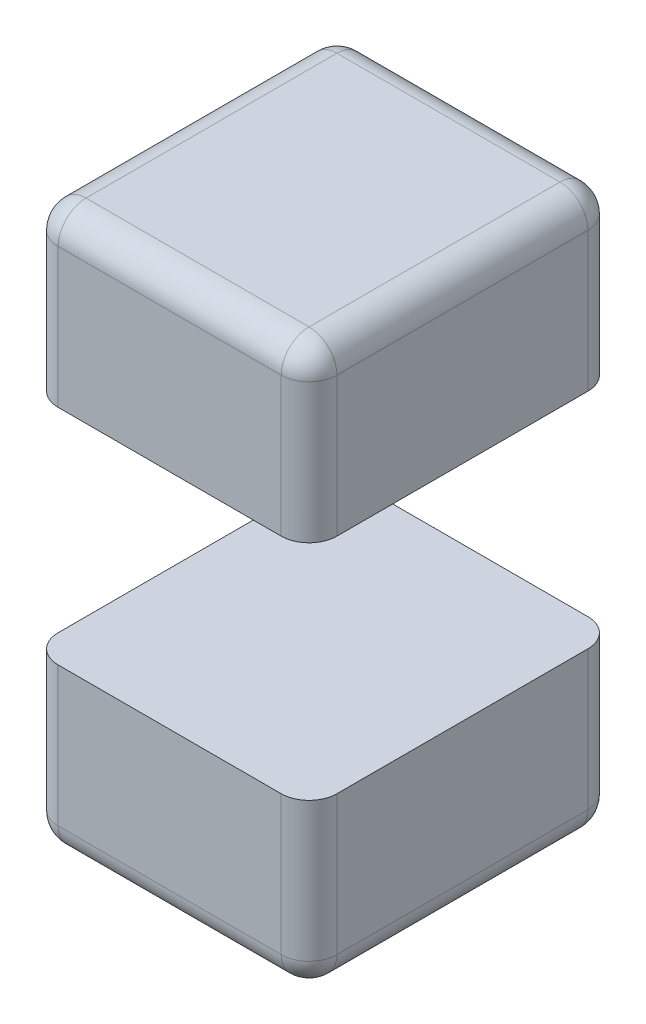
ISO-10303-21;
HEADER;
FILE_DESCRIPTION(('STEP AP214'),'2;1');
FILE_NAME('part.step','',(''),(''),'','','');
FILE_SCHEMA(('AUTOMOTIVE_DESIGN { 1 0 10303 214 1 1 1 1 }'));
ENDSEC;
DATA;
#1=APPLICATION_CONTEXT('core data for automotive mechanical design processes');
#2=APPLICATION_PROTOCOL_DEFINITION('international standard','automotive_design',2000,#1);
#3=PRODUCT_CONTEXT('',#1,'mechanical');
#4=PRODUCT('Part','Part','',(#3));
#5=PRODUCT_RELATED_PRODUCT_CATEGORY('part','',(#4));
#6=PRODUCT_DEFINITION_FORMATION('','',#4);
#7=PRODUCT_DEFINITION_CONTEXT('part definition',#1,'design');
#8=PRODUCT_DEFINITION('design','',#6,#7);
#9=PRODUCT_DEFINITION_SHAPE('','',#8);
#10=(LENGTH_UNIT() NAMED_UNIT(*) SI_UNIT(.MILLI.,.METRE.));
#11=(NAMED_UNIT(*) PLANE_ANGLE_UNIT() SI_UNIT($,.RADIAN.));
#12=(NAMED_UNIT(*) SI_UNIT($,.STERADIAN.) SOLID_ANGLE_UNIT());
#13=UNCERTAINTY_MEASURE_WITH_UNIT(LENGTH_MEASURE(1.E-05),#10,'distance_accuracy_value','');
#14=(GEOMETRIC_REPRESENTATION_CONTEXT(3) GLOBAL_UNCERTAINTY_ASSIGNED_CONTEXT((#13)) GLOBAL_UNIT_ASSIGNED_CONTEXT((#10,
#11,#12)) REPRESENTATION_CONTEXT('',''));
#15=CARTESIAN_POINT('',(0.,0.,0.));
#16=DIRECTION('',(0.,0.,1.));
#17=DIRECTION('',(1.,0.,0.));
#18=AXIS2_PLACEMENT_3D('',#15,#16,#17);
#19=CARTESIAN_POINT('',(13.574981507597,8.599994865557,0.));
#20=DIRECTION('',(4.371138828674E-08,-0.999999999999999,0.));
#21=DIRECTION('',(0.999999999999999,4.371138828674E-08,0.));
#22=AXIS2_PLACEMENT_3D('',#19,#20,#21);
#23=PLANE('',#22);
#24=DIRECTION('',(0.,0.,-1.));
#25=VECTOR('',#24,1.);
#26=CARTESIAN_POINT('',(14.024981507597,8.599994885227,0.));
#27=LINE('',#26,#25);
#28=CARTESIAN_POINT('',(14.0249815075972,8.5999948852266,0.05));
#29=VERTEX_POINT('',#28);
#30=CARTESIAN_POINT('',(14.0249815075972,8.5999948852266,0.5));
#31=VERTEX_POINT('',#30);
#32=EDGE_CURVE('P0_E96',#29,#31,#27,.F.);
#33=ORIENTED_EDGE('',*,*,#32,.F.);
#34=DIRECTION('',(-0.999999999999999,-4.371138828674E-08,0.));
#35=VECTOR('',#34,1.);
#36=CARTESIAN_POINT('',(13.6999815075974,8.59999487102,0.05));
#37=LINE('',#36,#35);
#38=CARTESIAN_POINT('',(13.6249815075972,8.59999486774182,0.05));
#39=VERTEX_POINT('',#38);
#40=EDGE_CURVE('P0_E117',#39,#29,#37,.F.);
#41=ORIENTED_EDGE('',*,*,#40,.F.);
#42=DIRECTION('',(0.,0.,-1.));
#43=VECTOR('',#42,1.);
#44=CARTESIAN_POINT('',(13.624981507597,8.599994867742,0.));
#45=LINE('',#44,#43);
#46=CARTESIAN_POINT('',(13.6249815075972,8.59999486774182,0.5));
#47=VERTEX_POINT('',#46);
#48=EDGE_CURVE('P0_E338',#47,#39,#45,.T.);
#49=ORIENTED_EDGE('',*,*,#48,.F.);
#50=DIRECTION('',(-0.999999999999999,-4.371138828674E-08,0.));
#51=VECTOR('',#50,1.);
#52=CARTESIAN_POINT('',(13.6999815075974,8.59999487102,0.5));
#53=LINE('',#52,#51);
#54=EDGE_CURVE('P0_E349',#31,#47,#53,.T.);
#55=ORIENTED_EDGE('',*,*,#54,.F.);
#56=EDGE_LOOP('',(#33,#41,#49,#55));
#57=FACE_BOUND('',#56,.T.);
#58=ADVANCED_FACE('P0_F17',(#57),#23,.F.);
#59=CARTESIAN_POINT('',(14.024981509783,8.549994885227,0.));
#60=DIRECTION('',(0.,0.,-1.));
#61=DIRECTION('',(-1.,0.,0.));
#62=AXIS2_PLACEMENT_3D('',#59,#60,#61);
#63=CYLINDRICAL_SURFACE('',#62,0.05);
#64=CARTESIAN_POINT('',(14.024981509783,8.549994885227,0.5));
#65=DIRECTION('',(0.,0.,-1.));
#66=DIRECTION('',(-1.,0.,0.));
#67=AXIS2_PLACEMENT_3D('',#64,#65,#66);
#68=CIRCLE('',#67,0.05);
#69=CARTESIAN_POINT('',(14.0749815097829,8.54999488741228,0.5));
#70=VERTEX_POINT('',#69);
#71=EDGE_CURVE('P0_E129',#70,#31,#68,.F.);
#72=ORIENTED_EDGE('',*,*,#71,.F.);
#73=DIRECTION('',(0.,0.,1.));
#74=VECTOR('',#73,1.);
#75=CARTESIAN_POINT('',(14.0749815097826,8.549994887412,0.));
#76=LINE('',#75,#74);
#77=CARTESIAN_POINT('',(14.0749815097829,8.54999488741228,0.05));
#78=VERTEX_POINT('',#77);
#79=EDGE_CURVE('P0_E125',#70,#78,#76,.F.);
#80=ORIENTED_EDGE('',*,*,#79,.T.);
#81=CARTESIAN_POINT('',(14.024981509783,8.549994885227,0.05));
#82=DIRECTION('',(0.,0.,-1.));
#83=DIRECTION('',(-1.,0.,0.));
#84=AXIS2_PLACEMENT_3D('',#81,#82,#83);
#85=CIRCLE('',#84,0.05);
#86=EDGE_CURVE('P0_E20',#29,#78,#85,.T.);
#87=ORIENTED_EDGE('',*,*,#86,.F.);
#88=ORIENTED_EDGE('',*,*,#32,.T.);
#89=EDGE_LOOP('',(#72,#80,#87,#88));
#90=FACE_BOUND('',#89,.T.);
#91=ADVANCED_FACE('P0_F105',(#90),#63,.T.);
#92=CARTESIAN_POINT('',(14.024981509783,8.549994885227,0.05));
#93=DIRECTION('',(0.577350243953125,0.577350294426125,-0.577350269189626));
#94=DIRECTION('',(0.707106812094878,-0.707106750278215,1.15130127653629E-13));
#95=AXIS2_PLACEMENT_3D('',#92,#93,#94);
#96=SPHERICAL_SURFACE('',#95,0.05);
#97=CARTESIAN_POINT('',(14.0538490219807,8.5788623999483,0.0211324865405184));
#98=VERTEX_POINT('',#97);
#99=VERTEX_LOOP('',#98);
#100=FACE_BOUND('',#99,.T.);
#101=ORIENTED_EDGE('',*,*,#86,.T.);
#102=CARTESIAN_POINT('',(14.0249815097832,8.549994885227,0.05));
#103=DIRECTION('',(-4.371138828674E-08,0.999999999999999,0.));
#104=DIRECTION('',(-0.999999999999999,-4.371138828674E-08,0.));
#105=AXIS2_PLACEMENT_3D('',#102,#103,#104);
#106=CIRCLE('',#105,0.05);
#107=CARTESIAN_POINT('',(14.0249815097828,8.5499948764845,0.));
#108=VERTEX_POINT('',#107);
#109=EDGE_CURVE('P0_E112',#108,#78,#106,.F.);
#110=ORIENTED_EDGE('',*,*,#109,.F.);
#111=CARTESIAN_POINT('',(14.0249815097826,8.5499948852262,0.05));
#112=DIRECTION('',(-0.999999999999999,-4.371138828674E-08,0.));
#113=DIRECTION('',(4.371138828674E-08,-0.999999999999999,0.));
#114=AXIS2_PLACEMENT_3D('',#111,#112,#113);
#115=CIRCLE('',#114,0.05);
#116=EDGE_CURVE('P0_E114',#29,#108,#115,.T.);
#117=ORIENTED_EDGE('',*,*,#116,.F.);
#118=EDGE_LOOP('',(#101,#110,#117));
#119=FACE_BOUND('',#118,.T.);
#120=ADVANCED_FACE('P0_F101',(#100,#119),#96,.T.);
#121=CARTESIAN_POINT('',(13.699981509783,8.54999487102,0.05));
#122=DIRECTION('',(-0.999999999999999,-4.371138828674E-08,0.));
#123=DIRECTION('',(4.371138828674E-08,-0.999999999999999,0.));
#124=AXIS2_PLACEMENT_3D('',#121,#122,#123);
#125=CYLINDRICAL_SURFACE('',#124,0.05);
#126=ORIENTED_EDGE('',*,*,#116,.T.);
#127=DIRECTION('',(-1.,0.,0.));
#128=VECTOR('',#127,1.);
#129=CARTESIAN_POINT('',(13.824981514154,8.549994867742,0.));
#130=LINE('',#129,#128);
#131=CARTESIAN_POINT('',(13.6249815097828,8.54999486774211,0.));
#132=VERTEX_POINT('',#131);
#133=EDGE_CURVE('P0_E138',#132,#108,#130,.F.);
#134=ORIENTED_EDGE('',*,*,#133,.F.);
#135=CARTESIAN_POINT('',(13.624981509783,8.54999486774165,0.05));
#136=DIRECTION('',(-0.999999999999999,-4.371138828674E-08,0.));
#137=DIRECTION('',(4.371138828674E-08,-0.999999999999999,0.));
#138=AXIS2_PLACEMENT_3D('',#135,#136,#137);
#139=CIRCLE('',#138,0.05);
#140=EDGE_CURVE('P0_E358',#39,#132,#139,.T.);
#141=ORIENTED_EDGE('',*,*,#140,.F.);
#142=ORIENTED_EDGE('',*,*,#40,.T.);
#143=EDGE_LOOP('',(#126,#134,#141,#142));
#144=FACE_BOUND('',#143,.T.);
#145=ADVANCED_FACE('P0_F104',(#144),#125,.T.);
#146=CARTESIAN_POINT('',(13.624981509783,8.549994867742,0.05));
#147=DIRECTION('',(-0.577350294426125,0.577350243953125,-0.577350269189626));
#148=DIRECTION('',(0.707106750278215,0.707106812094878,1.15130127653629E-13));
#149=AXIS2_PLACEMENT_3D('',#146,#147,#148);
#150=SPHERICAL_SURFACE('',#149,0.05);
#151=CARTESIAN_POINT('',(13.5961139950617,8.57886237993966,0.0211324865405184));
#152=VERTEX_POINT('',#151);
#153=VERTEX_LOOP('',#152);
#154=FACE_BOUND('',#153,.T.);
#155=ORIENTED_EDGE('',*,*,#140,.T.);
#156=CARTESIAN_POINT('',(13.6249815097825,8.54999486774257,0.05));
#157=DIRECTION('',(4.371138828674E-08,-0.999999999999999,0.));
#158=DIRECTION('',(0.999999999999999,4.371138828674E-08,0.));
#159=AXIS2_PLACEMENT_3D('',#156,#157,#158);
#160=CIRCLE('',#159,0.05);
#161=CARTESIAN_POINT('',(13.574981509783,8.54999486555672,0.05));
#162=VERTEX_POINT('',#161);
#163=EDGE_CURVE('P0_E378',#162,#132,#160,.T.);
#164=ORIENTED_EDGE('',*,*,#163,.F.);
#165=CARTESIAN_POINT('',(13.624981509783,8.549994867742,0.05));
#166=DIRECTION('',(0.,0.,-1.));
#167=DIRECTION('',(-1.,0.,0.));
#168=AXIS2_PLACEMENT_3D('',#165,#166,#167);
#169=CIRCLE('',#168,0.05);
#170=EDGE_CURVE('P0_E356',#39,#162,#169,.F.);
#171=ORIENTED_EDGE('',*,*,#170,.F.);
#172=EDGE_LOOP('',(#155,#164,#171));
#173=FACE_BOUND('',#172,.T.);
#174=ADVANCED_FACE('P0_F177',(#154,#173),#150,.T.);
#175=CARTESIAN_POINT('',(13.624981509783,8.549994867742,0.));
#176=DIRECTION('',(0.,0.,-1.));
#177=DIRECTION('',(-1.,0.,0.));
#178=AXIS2_PLACEMENT_3D('',#175,#176,#177);
#179=CYLINDRICAL_SURFACE('',#178,0.05);
#180=CARTESIAN_POINT('',(13.624981509783,8.549994867742,0.5));
#181=DIRECTION('',(0.,0.,-1.));
#182=DIRECTION('',(-1.,0.,0.));
#183=AXIS2_PLACEMENT_3D('',#180,#181,#182);
#184=CIRCLE('',#183,0.05);
#185=CARTESIAN_POINT('',(13.5749815097828,8.54999486555672,0.5));
#186=VERTEX_POINT('',#185);
#187=EDGE_CURVE('P0_E336',#47,#186,#184,.F.);
#188=ORIENTED_EDGE('',*,*,#187,.F.);
#189=ORIENTED_EDGE('',*,*,#48,.T.);
#190=ORIENTED_EDGE('',*,*,#170,.T.);
#191=DIRECTION('',(0.,0.,1.));
#192=VECTOR('',#191,1.);
#193=CARTESIAN_POINT('',(13.5749815097832,8.549994865557,0.));
#194=LINE('',#193,#192);
#195=EDGE_CURVE('P0_E152',#162,#186,#194,.T.);
#196=ORIENTED_EDGE('',*,*,#195,.T.);
#197=EDGE_LOOP('',(#188,#189,#190,#196));
#198=FACE_BOUND('',#197,.T.);
#199=ADVANCED_FACE('P0_F168',(#198),#179,.T.);
#200=CARTESIAN_POINT('',(13.624981509783,8.549994867742,0.5));
#201=DIRECTION('',(-0.577350294426266,0.577350243952805,0.577350269189805));
#202=DIRECTION('',(3.09085931571307E-08,-0.707106781186693,0.707106781186401));
#203=AXIS2_PLACEMENT_3D('',#200,#201,#202);
#204=SPHERICAL_SURFACE('',#203,0.05);
#205=CARTESIAN_POINT('',(13.5961139950617,8.57886237993964,0.52886751345949));
#206=VERTEX_POINT('',#205);
#207=VERTEX_LOOP('',#206);
#208=FACE_BOUND('',#207,.T.);
#209=ORIENTED_EDGE('',*,*,#187,.T.);
#210=CARTESIAN_POINT('',(13.6249815097825,8.549994867742,0.5));
#211=DIRECTION('',(4.371138828674E-08,-0.999999999999999,0.));
#212=DIRECTION('',(0.999999999999999,4.371138828674E-08,0.));
#213=AXIS2_PLACEMENT_3D('',#210,#211,#212);
#214=CIRCLE('',#213,0.05);
#215=CARTESIAN_POINT('',(13.6249815152468,8.549994867742,0.55));
#216=VERTEX_POINT('',#215);
#217=EDGE_CURVE('P0_E350',#216,#186,#214,.T.);
#218=ORIENTED_EDGE('',*,*,#217,.F.);
#219=CARTESIAN_POINT('',(13.6249815097826,8.54999486774165,0.5));
#220=DIRECTION('',(-0.999999999999999,-4.371138828674E-08,0.));
#221=DIRECTION('',(4.371138828674E-08,-0.999999999999999,0.));
#222=AXIS2_PLACEMENT_3D('',#219,#220,#221);
#223=CIRCLE('',#222,0.05);
#224=EDGE_CURVE('P0_E346',#47,#216,#223,.F.);
#225=ORIENTED_EDGE('',*,*,#224,.F.);
#226=EDGE_LOOP('',(#209,#218,#225));
#227=FACE_BOUND('',#226,.T.);
#228=ADVANCED_FACE('P0_F164',(#208,#227),#204,.T.);
#229=CARTESIAN_POINT('',(13.699981509783,8.54999487102,0.5));
#230=DIRECTION('',(-0.999999999999999,-4.371138828674E-08,0.));
#231=DIRECTION('',(4.371138828674E-08,-0.999999999999999,0.));
#232=AXIS2_PLACEMENT_3D('',#229,#230,#231);
#233=CYLINDRICAL_SURFACE('',#232,0.05);
#234=CARTESIAN_POINT('',(14.024981509783,8.5499948852262,0.5));
#235=DIRECTION('',(-0.999999999999999,-4.371138828674E-08,0.));
#236=DIRECTION('',(4.371138828674E-08,-0.999999999999999,0.));
#237=AXIS2_PLACEMENT_3D('',#234,#235,#236);
#238=CIRCLE('',#237,0.05);
#239=CARTESIAN_POINT('',(14.024981509783,8.54999487648428,0.55));
#240=VERTEX_POINT('',#239);
#241=EDGE_CURVE('P0_E133',#31,#240,#238,.F.);
#242=ORIENTED_EDGE('',*,*,#241,.F.);
#243=ORIENTED_EDGE('',*,*,#54,.T.);
#244=ORIENTED_EDGE('',*,*,#224,.T.);
#245=DIRECTION('',(-1.,0.,0.));
#246=VECTOR('',#245,1.);
#247=CARTESIAN_POINT('',(13.824981514154,8.549994867742,0.55));
#248=LINE('',#247,#246);
#249=EDGE_CURVE('P0_E145',#216,#240,#248,.F.);
#250=ORIENTED_EDGE('',*,*,#249,.T.);
#251=EDGE_LOOP('',(#242,#243,#244,#250));
#252=FACE_BOUND('',#251,.T.);
#253=ADVANCED_FACE('P0_F159',(#252),#233,.T.);
#254=CARTESIAN_POINT('',(14.024981509783,8.549994885227,0.5));
#255=DIRECTION('',(0.577350243952984,0.577350294425946,0.577350269189946));
#256=DIRECTION('',(3.09081850113912E-08,-0.707106781186808,0.707106781186286));
#257=AXIS2_PLACEMENT_3D('',#254,#255,#256);
#258=SPHERICAL_SURFACE('',#257,0.05);
#259=CARTESIAN_POINT('',(14.0538490219806,8.5788623999483,0.528867513459497));
#260=VERTEX_POINT('',#259);
#261=VERTEX_LOOP('',#260);
#262=FACE_BOUND('',#261,.T.);
#263=ORIENTED_EDGE('',*,*,#241,.T.);
#264=CARTESIAN_POINT('',(14.0249815097832,8.54999488522643,0.5));
#265=DIRECTION('',(-4.371138828674E-08,0.999999999999999,0.));
#266=DIRECTION('',(-0.999999999999999,-4.371138828674E-08,0.));
#267=AXIS2_PLACEMENT_3D('',#264,#265,#266);
#268=CIRCLE('',#267,0.05);
#269=EDGE_CURVE('P0_E148',#70,#240,#268,.F.);
#270=ORIENTED_EDGE('',*,*,#269,.F.);
#271=ORIENTED_EDGE('',*,*,#71,.T.);
#272=EDGE_LOOP('',(#263,#270,#271));
#273=FACE_BOUND('',#272,.T.);
#274=ADVANCED_FACE('P0_F155',(#262,#273),#258,.T.);
#275=CARTESIAN_POINT('',(14.074981507597,8.599994887412,0.));
#276=DIRECTION('',(-0.999999999999999,-4.371138828674E-08,0.));
#277=DIRECTION('',(4.371138828674E-08,-0.999999999999999,0.));
#278=AXIS2_PLACEMENT_3D('',#275,#276,#277);
#279=PLANE('',#278);
#280=DIRECTION('',(-4.371138828674E-08,0.999999999999999,0.));
#281=VECTOR('',#280,1.);
#282=CARTESIAN_POINT('',(14.074981510876,8.52499488741257,0.5));
#283=LINE('',#282,#281);
#284=CARTESIAN_POINT('',(14.074981520711,8.29999488741228,0.5));
#285=VERTEX_POINT('',#284);
#286=EDGE_CURVE('P0_E383',#285,#70,#283,.T.);
#287=ORIENTED_EDGE('',*,*,#286,.F.);
#288=DIRECTION('',(0.,0.,1.));
#289=VECTOR('',#288,1.);
#290=CARTESIAN_POINT('',(14.074981520711,8.299994887412,0.));
#291=LINE('',#290,#289);
#292=CARTESIAN_POINT('',(14.074981520711,8.299994887412,0.05));
#293=VERTEX_POINT('',#292);
#294=EDGE_CURVE('P0_E137',#285,#293,#291,.F.);
#295=ORIENTED_EDGE('',*,*,#294,.T.);
#296=DIRECTION('',(-4.371138828674E-08,0.999999999999999,0.));
#297=VECTOR('',#296,1.);
#298=CARTESIAN_POINT('',(14.074981510876,8.52499488741257,0.05));
#299=LINE('',#298,#297);
#300=EDGE_CURVE('P0_E122',#78,#293,#299,.F.);
#301=ORIENTED_EDGE('',*,*,#300,.F.);
#302=ORIENTED_EDGE('',*,*,#79,.F.);
#303=EDGE_LOOP('',(#287,#295,#301,#302));
#304=FACE_BOUND('',#303,.T.);
#305=ADVANCED_FACE('P0_F136',(#304),#279,.F.);
#306=CARTESIAN_POINT('',(14.024981510876,8.524994885227,0.05));
#307=DIRECTION('',(-4.371138828674E-08,0.999999999999999,0.));
#308=DIRECTION('',(-0.999999999999999,-4.371138828674E-08,0.));
#309=AXIS2_PLACEMENT_3D('',#306,#307,#308);
#310=CYLINDRICAL_SURFACE('',#309,0.05);
#311=CARTESIAN_POINT('',(14.0249815207111,8.29999488522643,0.05));
#312=DIRECTION('',(-4.371138828674E-08,0.999999999999999,0.));
#313=DIRECTION('',(-0.999999999999999,-4.371138828674E-08,0.));
#314=AXIS2_PLACEMENT_3D('',#311,#312,#313);
#315=CIRCLE('',#314,0.05);
#316=CARTESIAN_POINT('',(14.024981515247,8.29999488522643,0.));
#317=VERTEX_POINT('',#316);
#318=EDGE_CURVE('P0_E373',#293,#317,#315,.T.);
#319=ORIENTED_EDGE('',*,*,#318,.T.);
#320=DIRECTION('',(0.,1.,0.));
#321=VECTOR('',#320,1.);
#322=CARTESIAN_POINT('',(14.024981509783,8.449994876484,0.));
#323=LINE('',#322,#321);
#324=EDGE_CURVE('P0_E124',#108,#317,#323,.F.);
#325=ORIENTED_EDGE('',*,*,#324,.F.);
#326=ORIENTED_EDGE('',*,*,#109,.T.);
#327=ORIENTED_EDGE('',*,*,#300,.T.);
#328=EDGE_LOOP('',(#319,#325,#326,#327));
#329=FACE_BOUND('',#328,.T.);
#330=ADVANCED_FACE('P0_F120',(#329),#310,.T.);
#331=CARTESIAN_POINT('',(13.824981514154,8.449994876484,0.));
#332=DIRECTION('',(0.,0.,-1.));
#333=DIRECTION('',(-1.,0.,0.));
#334=AXIS2_PLACEMENT_3D('',#331,#332,#333);
#335=PLANE('',#334);
#336=DIRECTION('',(-0.999999999999999,-4.371138828674E-08,0.));
#337=VECTOR('',#336,1.);
#338=CARTESIAN_POINT('',(14.074981520711,8.299994887412,0.));
#339=LINE('',#338,#337);
#340=CARTESIAN_POINT('',(13.6249815207106,8.29999486774194,0.));
#341=VERTEX_POINT('',#340);
#342=EDGE_CURVE('P0_E372',#317,#341,#339,.T.);
#343=ORIENTED_EDGE('',*,*,#342,.T.);
#344=DIRECTION('',(4.371138828674E-08,-0.999999999999999,0.));
#345=VECTOR('',#344,1.);
#346=CARTESIAN_POINT('',(13.6249815174325,8.374994867742,0.));
#347=LINE('',#346,#345);
#348=EDGE_CURVE('P0_E380',#132,#341,#347,.T.);
#349=ORIENTED_EDGE('',*,*,#348,.F.);
#350=ORIENTED_EDGE('',*,*,#133,.T.);
#351=ORIENTED_EDGE('',*,*,#324,.T.);
#352=EDGE_LOOP('',(#343,#349,#350,#351));
#353=FACE_BOUND('',#352,.T.);
#354=ADVANCED_FACE('P0_F214',(#353),#335,.T.);
#355=CARTESIAN_POINT('',(13.624981517432,8.374994867742,0.05));
#356=DIRECTION('',(4.371138828674E-08,-0.999999999999999,0.));
#357=DIRECTION('',(0.999999999999999,4.371138828674E-08,0.));
#358=AXIS2_PLACEMENT_3D('',#355,#356,#357);
#359=CYLINDRICAL_SURFACE('',#358,0.05);
#360=CARTESIAN_POINT('',(13.6249815207104,8.299994867742,0.05));
#361=DIRECTION('',(4.371138828674E-08,-0.999999999999999,0.));
#362=DIRECTION('',(0.999999999999999,4.371138828674E-08,0.));
#363=AXIS2_PLACEMENT_3D('',#360,#361,#362);
#364=CIRCLE('',#363,0.05);
#365=CARTESIAN_POINT('',(13.574981520711,8.29999486555637,0.05));
#366=VERTEX_POINT('',#365);
#367=EDGE_CURVE('P0_E369',#341,#366,#364,.F.);
#368=ORIENTED_EDGE('',*,*,#367,.T.);
#369=DIRECTION('',(-4.371138828674E-08,0.999999999999999,0.));
#370=VECTOR('',#369,1.);
#371=CARTESIAN_POINT('',(13.574981520711,8.299994865557,0.05));
#372=LINE('',#371,#370);
#373=EDGE_CURVE('P0_E393',#366,#162,#372,.T.);
#374=ORIENTED_EDGE('',*,*,#373,.T.);
#375=ORIENTED_EDGE('',*,*,#163,.T.);
#376=ORIENTED_EDGE('',*,*,#348,.T.);
#377=EDGE_LOOP('',(#368,#374,#375,#376));
#378=FACE_BOUND('',#377,.T.);
#379=ADVANCED_FACE('P0_F210',(#378),#359,.T.);
#380=CARTESIAN_POINT('',(13.574981520711,8.299994865557,0.));
#381=DIRECTION('',(0.999999999999999,4.371138828674E-08,0.));
#382=DIRECTION('',(-4.371138828674E-08,0.999999999999999,0.));
#383=AXIS2_PLACEMENT_3D('',#380,#381,#382);
#384=PLANE('',#383);
#385=ORIENTED_EDGE('',*,*,#373,.F.);
#386=DIRECTION('',(0.,0.,1.));
#387=VECTOR('',#386,1.);
#388=CARTESIAN_POINT('',(13.574981520711,8.29999486555631,0.));
#389=LINE('',#388,#387);
#390=CARTESIAN_POINT('',(13.5749815207108,8.29999486555665,0.5));
#391=VERTEX_POINT('',#390);
#392=EDGE_CURVE('P0_E368',#366,#391,#389,.T.);
#393=ORIENTED_EDGE('',*,*,#392,.T.);
#394=DIRECTION('',(4.371138828674E-08,-0.999999999999999,0.));
#395=VECTOR('',#394,1.);
#396=CARTESIAN_POINT('',(13.574981517432,8.37499486555643,0.5));
#397=LINE('',#396,#395);
#398=EDGE_CURVE('P0_E377',#186,#391,#397,.T.);
#399=ORIENTED_EDGE('',*,*,#398,.F.);
#400=ORIENTED_EDGE('',*,*,#195,.F.);
#401=EDGE_LOOP('',(#385,#393,#399,#400));
#402=FACE_BOUND('',#401,.T.);
#403=ADVANCED_FACE('P0_F206',(#402),#384,.F.);
#404=CARTESIAN_POINT('',(13.624981517432,8.374994867742,0.5));
#405=DIRECTION('',(4.371138828674E-08,-0.999999999999999,0.));
#406=DIRECTION('',(0.999999999999999,4.371138828674E-08,0.));
#407=AXIS2_PLACEMENT_3D('',#404,#405,#406);
#408=CYLINDRICAL_SURFACE('',#407,0.05);
#409=CARTESIAN_POINT('',(13.6249815207104,8.29999486774257,0.5));
#410=DIRECTION('',(4.371138828674E-08,-0.999999999999999,0.));
#411=DIRECTION('',(0.999999999999999,4.371138828674E-08,0.));
#412=AXIS2_PLACEMENT_3D('',#409,#410,#411);
#413=CIRCLE('',#412,0.05);
#414=CARTESIAN_POINT('',(13.6249815207107,8.29999486774222,0.55));
#415=VERTEX_POINT('',#414);
#416=EDGE_CURVE('P0_E365',#391,#415,#413,.F.);
#417=ORIENTED_EDGE('',*,*,#416,.T.);
#418=DIRECTION('',(0.,1.,0.));
#419=VECTOR('',#418,1.);
#420=CARTESIAN_POINT('',(13.624981520711,8.449994876484,0.55));
#421=LINE('',#420,#419);
#422=EDGE_CURVE('P0_E149',#415,#216,#421,.T.);
#423=ORIENTED_EDGE('',*,*,#422,.T.);
#424=ORIENTED_EDGE('',*,*,#217,.T.);
#425=ORIENTED_EDGE('',*,*,#398,.T.);
#426=EDGE_LOOP('',(#417,#423,#424,#425));
#427=FACE_BOUND('',#426,.T.);
#428=ADVANCED_FACE('P0_F202',(#427),#408,.T.);
#429=CARTESIAN_POINT('',(13.824981514154,8.449994876484,0.55));
#430=DIRECTION('',(0.,0.,-1.));
#431=DIRECTION('',(-1.,0.,0.));
#432=AXIS2_PLACEMENT_3D('',#429,#430,#431);
#433=PLANE('',#432);
#434=ORIENTED_EDGE('',*,*,#422,.F.);
#435=DIRECTION('',(-0.999999999999999,-4.371138828674E-08,0.));
#436=VECTOR('',#435,1.);
#437=CARTESIAN_POINT('',(14.074981520711,8.299994887412,0.55));
#438=LINE('',#437,#436);
#439=CARTESIAN_POINT('',(14.024981520711,8.29999488522671,0.55));
#440=VERTEX_POINT('',#439);
#441=EDGE_CURVE('P0_E26',#415,#440,#438,.F.);
#442=ORIENTED_EDGE('',*,*,#441,.T.);
#443=DIRECTION('',(-4.371138828674E-08,0.999999999999999,0.));
#444=VECTOR('',#443,1.);
#445=CARTESIAN_POINT('',(14.0249815108758,8.524994885227,0.55));
#446=LINE('',#445,#444);
#447=EDGE_CURVE('P0_E34',#240,#440,#446,.F.);
#448=ORIENTED_EDGE('',*,*,#447,.F.);
#449=ORIENTED_EDGE('',*,*,#249,.F.);
#450=EDGE_LOOP('',(#434,#442,#448,#449));
#451=FACE_BOUND('',#450,.T.);
#452=ADVANCED_FACE('P0_F196',(#451),#433,.F.);
#453=CARTESIAN_POINT('',(14.024981510876,8.524994885227,0.5));
#454=DIRECTION('',(-4.371138828674E-08,0.999999999999999,0.));
#455=DIRECTION('',(-0.999999999999999,-4.371138828674E-08,0.));
#456=AXIS2_PLACEMENT_3D('',#453,#454,#455);
#457=CYLINDRICAL_SURFACE('',#456,0.05);
#458=CARTESIAN_POINT('',(14.0249815207111,8.299994885227,0.5));
#459=DIRECTION('',(-4.371138828674E-08,0.999999999999999,0.));
#460=DIRECTION('',(-0.999999999999999,-4.371138828674E-08,0.));
#461=AXIS2_PLACEMENT_3D('',#458,#459,#460);
#462=CIRCLE('',#461,0.05);
#463=EDGE_CURVE('P0_E11',#440,#285,#462,.T.);
#464=ORIENTED_EDGE('',*,*,#463,.T.);
#465=ORIENTED_EDGE('',*,*,#286,.T.);
#466=ORIENTED_EDGE('',*,*,#269,.T.);
#467=ORIENTED_EDGE('',*,*,#447,.T.);
#468=EDGE_LOOP('',(#464,#465,#466,#467));
#469=FACE_BOUND('',#468,.T.);
#470=ADVANCED_FACE('P0_F190',(#469),#457,.T.);
#471=CARTESIAN_POINT('',(14.074981520711,8.299994887412,0.));
#472=DIRECTION('',(-4.371138828674E-08,0.999999999999999,0.));
#473=DIRECTION('',(-0.999999999999999,-4.371138828674E-08,0.));
#474=AXIS2_PLACEMENT_3D('',#471,#472,#473);
#475=PLANE('',#474);
#476=ORIENTED_EDGE('',*,*,#441,.F.);
#477=ORIENTED_EDGE('',*,*,#416,.F.);
#478=ORIENTED_EDGE('',*,*,#392,.F.);
#479=ORIENTED_EDGE('',*,*,#367,.F.);
#480=ORIENTED_EDGE('',*,*,#342,.F.);
#481=ORIENTED_EDGE('',*,*,#318,.F.);
#482=ORIENTED_EDGE('',*,*,#294,.F.);
#483=ORIENTED_EDGE('',*,*,#463,.F.);
#484=EDGE_LOOP('',(#476,#477,#478,#479,#480,#481,#482,#483));
#485=FACE_BOUND('',#484,.T.);
#486=ADVANCED_FACE('P0_F188',(#485),#475,.F.);
#487=CLOSED_SHELL('',(#58,#91,#120,#145,#174,#199,#228,#253,#274,#305,#330,#354,#379,#403,#428,
#452,#470,#486));
#488=MANIFOLD_SOLID_BREP('P0_B1',#487);
#489=CARTESIAN_POINT('',(13.574981551309,7.599994865557,0.));
#490=DIRECTION('',(4.371138828674E-08,-0.999999999999999,0.));
#491=DIRECTION('',(0.999999999999999,4.371138828674E-08,0.));
#492=AXIS2_PLACEMENT_3D('',#489,#490,#491);
#493=PLANE('',#492);
#494=DIRECTION('',(0.999999999999999,4.371138828674E-08,0.));
#495=VECTOR('',#494,1.);
#496=CARTESIAN_POINT('',(13.6999815513086,7.59999487102,0.05));
#497=LINE('',#496,#495);
#498=CARTESIAN_POINT('',(14.0249815513088,7.5999948852266,0.05));
#499=VERTEX_POINT('',#498);
#500=CARTESIAN_POINT('',(13.6249815513088,7.59999486774182,0.05));
#501=VERTEX_POINT('',#500);
#502=EDGE_CURVE('P1_E242',#499,#501,#497,.F.);
#503=ORIENTED_EDGE('',*,*,#502,.F.);
#504=DIRECTION('',(0.,0.,1.));
#505=VECTOR('',#504,1.);
#506=CARTESIAN_POINT('',(14.024981551309,7.599994885227,0.));
#507=LINE('',#506,#505);
#508=CARTESIAN_POINT('',(14.0249815513088,7.5999948852266,0.5));
#509=VERTEX_POINT('',#508);
#510=EDGE_CURVE('P1_E103',#509,#499,#507,.F.);
#511=ORIENTED_EDGE('',*,*,#510,.F.);
#512=DIRECTION('',(0.999999999999999,4.371138828674E-08,0.));
#513=VECTOR('',#512,1.);
#514=CARTESIAN_POINT('',(13.6999815513086,7.59999487102,0.5));
#515=LINE('',#514,#513);
#516=CARTESIAN_POINT('',(13.6249815513088,7.59999486774182,0.5));
#517=VERTEX_POINT('',#516);
#518=EDGE_CURVE('P1_E227',#517,#509,#515,.T.);
#519=ORIENTED_EDGE('',*,*,#518,.F.);
#520=DIRECTION('',(0.,0.,1.));
#521=VECTOR('',#520,1.);
#522=CARTESIAN_POINT('',(13.624981551309,7.599994867742,0.));
#523=LINE('',#522,#521);
#524=EDGE_CURVE('P1_E235',#501,#517,#523,.T.);
#525=ORIENTED_EDGE('',*,*,#524,.F.);
#526=EDGE_LOOP('',(#503,#511,#519,#525));
#527=FACE_BOUND('',#526,.T.);
#528=ADVANCED_FACE('P1_F17',(#527),#493,.T.);
#529=CARTESIAN_POINT('',(14.024981549123,7.649994885227,0.5));
#530=DIRECTION('',(0.577350294426266,-0.577350243952805,0.577350269189805));
#531=DIRECTION('',(3.09085931571307E-08,-0.707106781186693,-0.707106781186401));
#532=AXIS2_PLACEMENT_3D('',#529,#530,#531);
#533=SPHERICAL_SURFACE('',#532,0.05);
#534=CARTESIAN_POINT('',(14.0538490638443,7.62112737302936,0.52886751345949));
#535=VERTEX_POINT('',#534);
#536=VERTEX_LOOP('',#535);
#537=FACE_BOUND('',#536,.T.);
#538=CARTESIAN_POINT('',(14.0249815491228,7.649994885227,0.5));
#539=DIRECTION('',(-4.371138828674E-08,0.999999999999999,0.));
#540=DIRECTION('',(-0.999999999999999,-4.371138828674E-08,0.));
#541=AXIS2_PLACEMENT_3D('',#538,#539,#540);
#542=CIRCLE('',#541,0.05);
#543=CARTESIAN_POINT('',(14.0249815491232,7.6499948764845,0.55));
#544=VERTEX_POINT('',#543);
#545=CARTESIAN_POINT('',(14.0749815491232,7.64999488741228,0.5));
#546=VERTEX_POINT('',#545);
#547=EDGE_CURVE('P1_E99',#544,#546,#542,.T.);
#548=ORIENTED_EDGE('',*,*,#547,.F.);
#549=CARTESIAN_POINT('',(14.0249815491234,7.6499948852262,0.5));
#550=DIRECTION('',(0.999999999999999,4.371138828674E-08,0.));
#551=DIRECTION('',(-4.371138828674E-08,0.999999999999999,0.));
#552=AXIS2_PLACEMENT_3D('',#549,#550,#551);
#553=CIRCLE('',#552,0.05);
#554=EDGE_CURVE('P1_E101',#509,#544,#553,.F.);
#555=ORIENTED_EDGE('',*,*,#554,.F.);
#556=CARTESIAN_POINT('',(14.024981549123,7.649994885227,0.5));
#557=DIRECTION('',(0.,0.,1.));
#558=DIRECTION('',(1.,0.,0.));
#559=AXIS2_PLACEMENT_3D('',#556,#557,#558);
#560=CIRCLE('',#559,0.05);
#561=EDGE_CURVE('P1_E20',#546,#509,#560,.F.);
#562=ORIENTED_EDGE('',*,*,#561,.F.);
#563=EDGE_LOOP('',(#548,#555,#562));
#564=FACE_BOUND('',#563,.T.);
#565=ADVANCED_FACE('P1_F97',(#537,#564),#533,.T.);
#566=CARTESIAN_POINT('',(14.024981549123,7.649994885227,0.));
#567=DIRECTION('',(0.,0.,1.));
#568=DIRECTION('',(1.,0.,0.));
#569=AXIS2_PLACEMENT_3D('',#566,#567,#568);
#570=CYLINDRICAL_SURFACE('',#569,0.05);
#571=ORIENTED_EDGE('',*,*,#561,.T.);
#572=ORIENTED_EDGE('',*,*,#510,.T.);
#573=CARTESIAN_POINT('',(14.024981549123,7.649994885227,0.05));
#574=DIRECTION('',(0.,0.,1.));
#575=DIRECTION('',(1.,0.,0.));
#576=AXIS2_PLACEMENT_3D('',#573,#574,#575);
#577=CIRCLE('',#576,0.05);
#578=CARTESIAN_POINT('',(14.0749815491231,7.64999488741228,0.05));
#579=VERTEX_POINT('',#578);
#580=EDGE_CURVE('P1_E108',#579,#499,#577,.F.);
#581=ORIENTED_EDGE('',*,*,#580,.F.);
#582=DIRECTION('',(0.,0.,1.));
#583=VECTOR('',#582,1.);
#584=CARTESIAN_POINT('',(14.0749815491234,7.649994887412,0.));
#585=LINE('',#584,#583);
#586=EDGE_CURVE('P1_E105',#546,#579,#585,.F.);
#587=ORIENTED_EDGE('',*,*,#586,.F.);
#588=EDGE_LOOP('',(#571,#572,#581,#587));
#589=FACE_BOUND('',#588,.T.);
#590=ADVANCED_FACE('P1_F106',(#589),#570,.T.);
#591=CARTESIAN_POINT('',(14.024981549123,7.649994885227,0.05));
#592=DIRECTION('',(0.577350294426125,-0.577350243953125,-0.577350269189626));
#593=DIRECTION('',(-0.707106750278215,-0.707106812094878,1.15130127653629E-13));
#594=AXIS2_PLACEMENT_3D('',#591,#592,#593);
#595=SPHERICAL_SURFACE('',#594,0.05);
#596=CARTESIAN_POINT('',(14.0538490638443,7.62112737302934,0.0211324865405184));
#597=VERTEX_POINT('',#596);
#598=VERTEX_LOOP('',#597);
#599=FACE_BOUND('',#598,.T.);
#600=CARTESIAN_POINT('',(14.0249815491228,7.64999488522643,0.05));
#601=DIRECTION('',(-4.371138828674E-08,0.999999999999999,0.));
#602=DIRECTION('',(-0.999999999999999,-4.371138828674E-08,0.));
#603=AXIS2_PLACEMENT_3D('',#600,#601,#602);
#604=CIRCLE('',#603,0.05);
#605=CARTESIAN_POINT('',(14.0249815491229,7.64999487648422,0.));
#606=VERTEX_POINT('',#605);
#607=EDGE_CURVE('P1_E127',#579,#606,#604,.T.);
#608=ORIENTED_EDGE('',*,*,#607,.F.);
#609=ORIENTED_EDGE('',*,*,#580,.T.);
#610=CARTESIAN_POINT('',(14.024981549123,7.6499948852262,0.05));
#611=DIRECTION('',(0.999999999999999,4.371138828674E-08,0.));
#612=DIRECTION('',(-4.371138828674E-08,0.999999999999999,0.));
#613=AXIS2_PLACEMENT_3D('',#610,#611,#612);
#614=CIRCLE('',#613,0.05);
#615=EDGE_CURVE('P1_E243',#606,#499,#614,.F.);
#616=ORIENTED_EDGE('',*,*,#615,.F.);
#617=EDGE_LOOP('',(#608,#609,#616));
#618=FACE_BOUND('',#617,.T.);
#619=ADVANCED_FACE('P1_F171',(#599,#618),#595,.T.);
#620=CARTESIAN_POINT('',(13.699981549123,7.64999487102,0.05));
#621=DIRECTION('',(0.999999999999999,4.371138828674E-08,0.));
#622=DIRECTION('',(-4.371138828674E-08,0.999999999999999,0.));
#623=AXIS2_PLACEMENT_3D('',#620,#621,#622);
#624=CYLINDRICAL_SURFACE('',#623,0.05);
#625=ORIENTED_EDGE('',*,*,#615,.T.);
#626=ORIENTED_EDGE('',*,*,#502,.T.);
#627=CARTESIAN_POINT('',(13.6249815491234,7.64999486774165,0.05));
#628=DIRECTION('',(0.999999999999999,4.371138828674E-08,0.));
#629=DIRECTION('',(-4.371138828674E-08,0.999999999999999,0.));
#630=AXIS2_PLACEMENT_3D('',#627,#628,#629);
#631=CIRCLE('',#630,0.05);
#632=CARTESIAN_POINT('',(13.6249815491231,7.64999486774182,0.));
#633=VERTEX_POINT('',#632);
#634=EDGE_CURVE('P1_E239',#633,#501,#631,.F.);
#635=ORIENTED_EDGE('',*,*,#634,.F.);
#636=DIRECTION('',(1.,0.,0.));
#637=VECTOR('',#636,1.);
#638=CARTESIAN_POINT('',(13.824981544752,7.649994867742,0.));
#639=LINE('',#638,#637);
#640=EDGE_CURVE('P1_E145',#633,#606,#639,.T.);
#641=ORIENTED_EDGE('',*,*,#640,.T.);
#642=EDGE_LOOP('',(#625,#626,#635,#641));
#643=FACE_BOUND('',#642,.T.);
#644=ADVANCED_FACE('P1_F162',(#643),#624,.T.);
#645=CARTESIAN_POINT('',(13.624981549123,7.649994867742,0.05));
#646=DIRECTION('',(-0.577350243953125,-0.577350294426125,-0.577350269189626));
#647=DIRECTION('',(-0.707106812094878,0.707106750278215,1.15130127653629E-13));
#648=AXIS2_PLACEMENT_3D('',#645,#646,#647);
#649=SPHERICAL_SURFACE('',#648,0.05);
#650=CARTESIAN_POINT('',(13.5961140369253,7.62112735302069,0.0211324865405187));
#651=VERTEX_POINT('',#650);
#652=VERTEX_LOOP('',#651);
#653=FACE_BOUND('',#652,.T.);
#654=CARTESIAN_POINT('',(13.6249815491235,7.649994867742,0.05));
#655=DIRECTION('',(4.371138828674E-08,-0.999999999999999,0.));
#656=DIRECTION('',(0.999999999999999,4.371138828674E-08,0.));
#657=AXIS2_PLACEMENT_3D('',#654,#655,#656);
#658=CIRCLE('',#657,0.05);
#659=CARTESIAN_POINT('',(13.574981549123,7.64999486555671,0.05));
#660=VERTEX_POINT('',#659);
#661=EDGE_CURVE('P1_E265',#633,#660,#658,.F.);
#662=ORIENTED_EDGE('',*,*,#661,.F.);
#663=ORIENTED_EDGE('',*,*,#634,.T.);
#664=CARTESIAN_POINT('',(13.624981549123,7.649994867742,0.05));
#665=DIRECTION('',(0.,0.,1.));
#666=DIRECTION('',(1.,0.,0.));
#667=AXIS2_PLACEMENT_3D('',#664,#665,#666);
#668=CIRCLE('',#667,0.05);
#669=EDGE_CURVE('P1_E236',#660,#501,#668,.T.);
#670=ORIENTED_EDGE('',*,*,#669,.F.);
#671=EDGE_LOOP('',(#662,#663,#670));
#672=FACE_BOUND('',#671,.T.);
#673=ADVANCED_FACE('P1_F158',(#653,#672),#649,.T.);
#674=CARTESIAN_POINT('',(13.624981549123,7.649994867742,0.));
#675=DIRECTION('',(0.,0.,1.));
#676=DIRECTION('',(1.,0.,0.));
#677=AXIS2_PLACEMENT_3D('',#674,#675,#676);
#678=CYLINDRICAL_SURFACE('',#677,0.05);
#679=CARTESIAN_POINT('',(13.624981549123,7.649994867742,0.5));
#680=DIRECTION('',(0.,0.,1.));
#681=DIRECTION('',(1.,0.,0.));
#682=AXIS2_PLACEMENT_3D('',#679,#680,#681);
#683=CIRCLE('',#682,0.05);
#684=CARTESIAN_POINT('',(13.5749815491232,7.64999486555671,0.5));
#685=VERTEX_POINT('',#684);
#686=EDGE_CURVE('P1_E232',#685,#517,#683,.T.);
#687=ORIENTED_EDGE('',*,*,#686,.F.);
#688=DIRECTION('',(0.,0.,1.));
#689=VECTOR('',#688,1.);
#690=CARTESIAN_POINT('',(13.5749815491228,7.649994865557,0.));
#691=LINE('',#690,#689);
#692=EDGE_CURVE('P1_E138',#660,#685,#691,.T.);
#693=ORIENTED_EDGE('',*,*,#692,.F.);
#694=ORIENTED_EDGE('',*,*,#669,.T.);
#695=ORIENTED_EDGE('',*,*,#524,.T.);
#696=EDGE_LOOP('',(#687,#693,#694,#695));
#697=FACE_BOUND('',#696,.T.);
#698=ADVANCED_FACE('P1_F153',(#697),#678,.T.);
#699=CARTESIAN_POINT('',(13.624981549123,7.649994867742,0.5));
#700=DIRECTION('',(-0.577350243952984,-0.577350294425946,0.577350269189946));
#701=DIRECTION('',(3.09081850113912E-08,-0.707106781186808,-0.707106781186286));
#702=AXIS2_PLACEMENT_3D('',#699,#700,#701);
#703=SPHERICAL_SURFACE('',#702,0.05);
#704=CARTESIAN_POINT('',(13.5961140369254,7.6211273530207,0.528867513459497));
#705=VERTEX_POINT('',#704);
#706=VERTEX_LOOP('',#705);
#707=FACE_BOUND('',#706,.T.);
#708=CARTESIAN_POINT('',(13.6249815491235,7.64999486774257,0.5));
#709=DIRECTION('',(4.371138828674E-08,-0.999999999999999,0.));
#710=DIRECTION('',(0.999999999999999,4.371138828674E-08,0.));
#711=AXIS2_PLACEMENT_3D('',#708,#709,#710);
#712=CIRCLE('',#711,0.05);
#713=CARTESIAN_POINT('',(13.624981543659,7.64999486774211,0.549999999999999));
#714=VERTEX_POINT('',#713);
#715=EDGE_CURVE('P1_E263',#685,#714,#712,.F.);
#716=ORIENTED_EDGE('',*,*,#715,.F.);
#717=ORIENTED_EDGE('',*,*,#686,.T.);
#718=CARTESIAN_POINT('',(13.624981549123,7.64999486774165,0.5));
#719=DIRECTION('',(0.999999999999999,4.371138828674E-08,0.));
#720=DIRECTION('',(-4.371138828674E-08,0.999999999999999,0.));
#721=AXIS2_PLACEMENT_3D('',#718,#719,#720);
#722=CIRCLE('',#721,0.05);
#723=EDGE_CURVE('P1_E229',#714,#517,#722,.T.);
#724=ORIENTED_EDGE('',*,*,#723,.F.);
#725=EDGE_LOOP('',(#716,#717,#724));
#726=FACE_BOUND('',#725,.T.);
#727=ADVANCED_FACE('P1_F148',(#707,#726),#703,.T.);
#728=CARTESIAN_POINT('',(13.699981549123,7.64999487102,0.5));
#729=DIRECTION('',(0.999999999999999,4.371138828674E-08,0.));
#730=DIRECTION('',(-4.371138828674E-08,0.999999999999999,0.));
#731=AXIS2_PLACEMENT_3D('',#728,#729,#730);
#732=CYLINDRICAL_SURFACE('',#731,0.05);
#733=ORIENTED_EDGE('',*,*,#554,.T.);
#734=DIRECTION('',(1.,0.,0.));
#735=VECTOR('',#734,1.);
#736=CARTESIAN_POINT('',(13.824981544752,7.649994867742,0.55));
#737=LINE('',#736,#735);
#738=EDGE_CURVE('P1_E135',#714,#544,#737,.T.);
#739=ORIENTED_EDGE('',*,*,#738,.F.);
#740=ORIENTED_EDGE('',*,*,#723,.T.);
#741=ORIENTED_EDGE('',*,*,#518,.T.);
#742=EDGE_LOOP('',(#733,#739,#740,#741));
#743=FACE_BOUND('',#742,.T.);
#744=ADVANCED_FACE('P1_F152',(#743),#732,.T.);
#745=CARTESIAN_POINT('',(14.02498154803,7.674994885227,0.5));
#746=DIRECTION('',(-4.371138828674E-08,0.999999999999999,0.));
#747=DIRECTION('',(-0.999999999999999,-4.371138828674E-08,0.));
#748=AXIS2_PLACEMENT_3D('',#745,#746,#747);
#749=CYLINDRICAL_SURFACE('',#748,0.05);
#750=CARTESIAN_POINT('',(14.0249815381949,7.89999488522643,0.5));
#751=DIRECTION('',(-4.371138828674E-08,0.999999999999999,0.));
#752=DIRECTION('',(-0.999999999999999,-4.371138828674E-08,0.));
#753=AXIS2_PLACEMENT_3D('',#750,#751,#752);
#754=CIRCLE('',#753,0.05);
#755=CARTESIAN_POINT('',(14.024981543659,7.89999488522643,0.55));
#756=VERTEX_POINT('',#755);
#757=CARTESIAN_POINT('',(14.0749815381953,7.899994887412,0.5));
#758=VERTEX_POINT('',#757);
#759=EDGE_CURVE('P1_E261',#756,#758,#754,.T.);
#760=ORIENTED_EDGE('',*,*,#759,.F.);
#761=DIRECTION('',(0.,1.,0.));
#762=VECTOR('',#761,1.);
#763=CARTESIAN_POINT('',(14.024981549123,7.749994876484,0.55));
#764=LINE('',#763,#762);
#765=EDGE_CURVE('P1_E120',#544,#756,#764,.T.);
#766=ORIENTED_EDGE('',*,*,#765,.F.);
#767=ORIENTED_EDGE('',*,*,#547,.T.);
#768=DIRECTION('',(-4.371138828674E-08,0.999999999999999,0.));
#769=VECTOR('',#768,1.);
#770=CARTESIAN_POINT('',(14.074981551309,7.599994887412,0.5));
#771=LINE('',#770,#769);
#772=EDGE_CURVE('P1_E113',#758,#546,#771,.F.);
#773=ORIENTED_EDGE('',*,*,#772,.F.);
#774=EDGE_LOOP('',(#760,#766,#767,#773));
#775=FACE_BOUND('',#774,.T.);
#776=ADVANCED_FACE('P1_F117',(#775),#749,.T.);
#777=CARTESIAN_POINT('',(14.074981551309,7.599994887412,0.));
#778=DIRECTION('',(0.999999999999999,4.371138828674E-08,0.));
#779=DIRECTION('',(-4.371138828674E-08,0.999999999999999,0.));
#780=AXIS2_PLACEMENT_3D('',#777,#778,#779);
#781=PLANE('',#780);
#782=DIRECTION('',(0.,0.,1.));
#783=VECTOR('',#782,1.);
#784=CARTESIAN_POINT('',(14.074981538195,7.899994887412,0.));
#785=LINE('',#784,#783);
#786=CARTESIAN_POINT('',(14.074981538195,7.89999488741228,0.05));
#787=VERTEX_POINT('',#786);
#788=EDGE_CURVE('P1_E125',#758,#787,#785,.F.);
#789=ORIENTED_EDGE('',*,*,#788,.F.);
#790=ORIENTED_EDGE('',*,*,#772,.T.);
#791=ORIENTED_EDGE('',*,*,#586,.T.);
#792=DIRECTION('',(-4.371138828674E-08,0.999999999999999,0.));
#793=VECTOR('',#792,1.);
#794=CARTESIAN_POINT('',(14.07498154803,7.67499488741257,0.05));
#795=LINE('',#794,#793);
#796=EDGE_CURVE('P1_E130',#787,#579,#795,.F.);
#797=ORIENTED_EDGE('',*,*,#796,.F.);
#798=EDGE_LOOP('',(#789,#790,#791,#797));
#799=FACE_BOUND('',#798,.T.);
#800=ADVANCED_FACE('P1_F123',(#799),#781,.T.);
#801=CARTESIAN_POINT('',(14.02498154803,7.674994885227,0.05));
#802=DIRECTION('',(-4.371138828674E-08,0.999999999999999,0.));
#803=DIRECTION('',(-0.999999999999999,-4.371138828674E-08,0.));
#804=AXIS2_PLACEMENT_3D('',#801,#802,#803);
#805=CYLINDRICAL_SURFACE('',#804,0.05);
#806=CARTESIAN_POINT('',(14.0249815381949,7.899994885227,0.05));
#807=DIRECTION('',(-4.371138828674E-08,0.999999999999999,0.));
#808=DIRECTION('',(-0.999999999999999,-4.371138828674E-08,0.));
#809=AXIS2_PLACEMENT_3D('',#806,#807,#808);
#810=CIRCLE('',#809,0.05);
#811=CARTESIAN_POINT('',(14.024981543659,7.89999488522672,0.));
#812=VERTEX_POINT('',#811);
#813=EDGE_CURVE('P1_E258',#787,#812,#810,.T.);
#814=ORIENTED_EDGE('',*,*,#813,.F.);
#815=ORIENTED_EDGE('',*,*,#796,.T.);
#816=ORIENTED_EDGE('',*,*,#607,.T.);
#817=DIRECTION('',(0.,1.,0.));
#818=VECTOR('',#817,1.);
#819=CARTESIAN_POINT('',(14.024981549123,7.749994876484,0.));
#820=LINE('',#819,#818);
#821=EDGE_CURVE('P1_E272',#606,#812,#820,.T.);
#822=ORIENTED_EDGE('',*,*,#821,.T.);
#823=EDGE_LOOP('',(#814,#815,#816,#822));
#824=FACE_BOUND('',#823,.T.);
#825=ADVANCED_FACE('P1_F210',(#824),#805,.T.);
#826=CARTESIAN_POINT('',(13.824981544752,7.749994876484,0.));
#827=DIRECTION('',(0.,0.,1.));
#828=DIRECTION('',(1.,0.,0.));
#829=AXIS2_PLACEMENT_3D('',#826,#827,#828);
#830=PLANE('',#829);
#831=DIRECTION('',(4.371138828674E-08,-0.999999999999999,0.));
#832=VECTOR('',#831,1.);
#833=CARTESIAN_POINT('',(13.6249815414734,7.824994867742,0.));
#834=LINE('',#833,#832);
#835=CARTESIAN_POINT('',(13.6249815381953,7.89999486774222,0.));
#836=VERTEX_POINT('',#835);
#837=EDGE_CURVE('P1_E142',#836,#633,#834,.T.);
#838=ORIENTED_EDGE('',*,*,#837,.F.);
#839=DIRECTION('',(-0.999999999999999,-4.371138828674E-08,0.));
#840=VECTOR('',#839,1.);
#841=CARTESIAN_POINT('',(14.074981538195,7.899994887412,0.));
#842=LINE('',#841,#840);
#843=EDGE_CURVE('P1_E257',#812,#836,#842,.T.);
#844=ORIENTED_EDGE('',*,*,#843,.F.);
#845=ORIENTED_EDGE('',*,*,#821,.F.);
#846=ORIENTED_EDGE('',*,*,#640,.F.);
#847=EDGE_LOOP('',(#838,#844,#845,#846));
#848=FACE_BOUND('',#847,.T.);
#849=ADVANCED_FACE('P1_F206',(#848),#830,.F.);
#850=CARTESIAN_POINT('',(13.624981541474,7.824994867742,0.05));
#851=DIRECTION('',(4.371138828674E-08,-0.999999999999999,0.));
#852=DIRECTION('',(0.999999999999999,4.371138828674E-08,0.));
#853=AXIS2_PLACEMENT_3D('',#850,#851,#852);
#854=CYLINDRICAL_SURFACE('',#853,0.05);
#855=CARTESIAN_POINT('',(13.6249815381956,7.89999486774257,0.05));
#856=DIRECTION('',(4.371138828674E-08,-0.999999999999999,0.));
#857=DIRECTION('',(0.999999999999999,4.371138828674E-08,0.));
#858=AXIS2_PLACEMENT_3D('',#855,#856,#857);
#859=CIRCLE('',#858,0.05);
#860=CARTESIAN_POINT('',(13.574981538195,7.89999486555665,0.05));
#861=VERTEX_POINT('',#860);
#862=EDGE_CURVE('P1_E254',#836,#861,#859,.F.);
#863=ORIENTED_EDGE('',*,*,#862,.F.);
#864=ORIENTED_EDGE('',*,*,#837,.T.);
#865=ORIENTED_EDGE('',*,*,#661,.T.);
#866=DIRECTION('',(4.371138828674E-08,-0.999999999999999,0.));
#867=VECTOR('',#866,1.);
#868=CARTESIAN_POINT('',(13.574981538195,7.899994865557,0.05));
#869=LINE('',#868,#867);
#870=EDGE_CURVE('P1_E141',#861,#660,#869,.T.);
#871=ORIENTED_EDGE('',*,*,#870,.F.);
#872=EDGE_LOOP('',(#863,#864,#865,#871));
#873=FACE_BOUND('',#872,.T.);
#874=ADVANCED_FACE('P1_F202',(#873),#854,.T.);
#875=CARTESIAN_POINT('',(13.574981538195,7.899994865557,0.));
#876=DIRECTION('',(-0.999999999999999,-4.371138828674E-08,0.));
#877=DIRECTION('',(4.371138828674E-08,-0.999999999999999,0.));
#878=AXIS2_PLACEMENT_3D('',#875,#876,#877);
#879=PLANE('',#878);
#880=DIRECTION('',(0.,0.,1.));
#881=VECTOR('',#880,1.);
#882=CARTESIAN_POINT('',(13.574981538195,7.89999486555631,0.));
#883=LINE('',#882,#881);
#884=CARTESIAN_POINT('',(13.5749815381953,7.89999486555643,0.5));
#885=VERTEX_POINT('',#884);
#886=EDGE_CURVE('P1_E253',#861,#885,#883,.T.);
#887=ORIENTED_EDGE('',*,*,#886,.F.);
#888=ORIENTED_EDGE('',*,*,#870,.T.);
#889=ORIENTED_EDGE('',*,*,#692,.T.);
#890=DIRECTION('',(4.371138828674E-08,-0.999999999999999,0.));
#891=VECTOR('',#890,1.);
#892=CARTESIAN_POINT('',(13.574981541474,7.82499486555643,0.5));
#893=LINE('',#892,#891);
#894=EDGE_CURVE('P1_E137',#885,#685,#893,.T.);
#895=ORIENTED_EDGE('',*,*,#894,.F.);
#896=EDGE_LOOP('',(#887,#888,#889,#895));
#897=FACE_BOUND('',#896,.T.);
#898=ADVANCED_FACE('P1_F199',(#897),#879,.T.);
#899=CARTESIAN_POINT('',(13.624981541474,7.824994867742,0.5));
#900=DIRECTION('',(4.371138828674E-08,-0.999999999999999,0.));
#901=DIRECTION('',(0.999999999999999,4.371138828674E-08,0.));
#902=AXIS2_PLACEMENT_3D('',#899,#900,#901);
#903=CYLINDRICAL_SURFACE('',#902,0.05);
#904=CARTESIAN_POINT('',(13.6249815381956,7.899994867742,0.5));
#905=DIRECTION('',(4.371138828674E-08,-0.999999999999999,0.));
#906=DIRECTION('',(0.999999999999999,4.371138828674E-08,0.));
#907=AXIS2_PLACEMENT_3D('',#904,#905,#906);
#908=CIRCLE('',#907,0.05);
#909=CARTESIAN_POINT('',(13.6249815381953,7.89999486774194,0.55));
#910=VERTEX_POINT('',#909);
#911=EDGE_CURVE('P1_E26',#885,#910,#908,.F.);
#912=ORIENTED_EDGE('',*,*,#911,.F.);
#913=ORIENTED_EDGE('',*,*,#894,.T.);
#914=ORIENTED_EDGE('',*,*,#715,.T.);
#915=DIRECTION('',(0.,1.,0.));
#916=VECTOR('',#915,1.);
#917=CARTESIAN_POINT('',(13.624981538195,7.749994876484,0.55));
#918=LINE('',#917,#916);
#919=EDGE_CURVE('P1_E35',#910,#714,#918,.F.);
#920=ORIENTED_EDGE('',*,*,#919,.F.);
#921=EDGE_LOOP('',(#912,#913,#914,#920));
#922=FACE_BOUND('',#921,.T.);
#923=ADVANCED_FACE('P1_F192',(#922),#903,.T.);
#924=CARTESIAN_POINT('',(13.824981544752,7.749994876484,0.55));
#925=DIRECTION('',(0.,0.,1.));
#926=DIRECTION('',(1.,0.,0.));
#927=AXIS2_PLACEMENT_3D('',#924,#925,#926);
#928=PLANE('',#927);
#929=DIRECTION('',(-0.999999999999999,-4.371138828674E-08,0.));
#930=VECTOR('',#929,1.);
#931=CARTESIAN_POINT('',(14.074981538195,7.899994887412,0.55));
#932=LINE('',#931,#930);
#933=EDGE_CURVE('P1_E11',#910,#756,#932,.F.);
#934=ORIENTED_EDGE('',*,*,#933,.F.);
#935=ORIENTED_EDGE('',*,*,#919,.T.);
#936=ORIENTED_EDGE('',*,*,#738,.T.);
#937=ORIENTED_EDGE('',*,*,#765,.T.);
#938=EDGE_LOOP('',(#934,#935,#936,#937));
#939=FACE_BOUND('',#938,.T.);
#940=ADVANCED_FACE('P1_F186',(#939),#928,.T.);
#941=CARTESIAN_POINT('',(14.074981538195,7.899994887412,0.));
#942=DIRECTION('',(-4.371138828674E-08,0.999999999999999,0.));
#943=DIRECTION('',(-0.999999999999999,-4.371138828674E-08,0.));
#944=AXIS2_PLACEMENT_3D('',#941,#942,#943);
#945=PLANE('',#944);
#946=ORIENTED_EDGE('',*,*,#911,.T.);
#947=ORIENTED_EDGE('',*,*,#933,.T.);
#948=ORIENTED_EDGE('',*,*,#759,.T.);
#949=ORIENTED_EDGE('',*,*,#788,.T.);
#950=ORIENTED_EDGE('',*,*,#813,.T.);
#951=ORIENTED_EDGE('',*,*,#843,.T.);
#952=ORIENTED_EDGE('',*,*,#862,.T.);
#953=ORIENTED_EDGE('',*,*,#886,.T.);
#954=EDGE_LOOP('',(#946,#947,#948,#949,#950,#951,#952,#953));
#955=FACE_BOUND('',#954,.T.);
#956=ADVANCED_FACE('P1_F184',(#955),#945,.T.);
#957=CLOSED_SHELL('',(#528,#565,#590,#619,#644,#673,#698,#727,#744,#776,#800,#825,#849,#874,
#898,#923,#940,#956));
#958=MANIFOLD_SOLID_BREP('P1_B1',#957);
#959=ADVANCED_BREP_SHAPE_REPRESENTATION('',(#18,#488,#958),#14);
#960=SHAPE_DEFINITION_REPRESENTATION(#9,#959);
ENDSEC;
END-ISO-10303-21;
